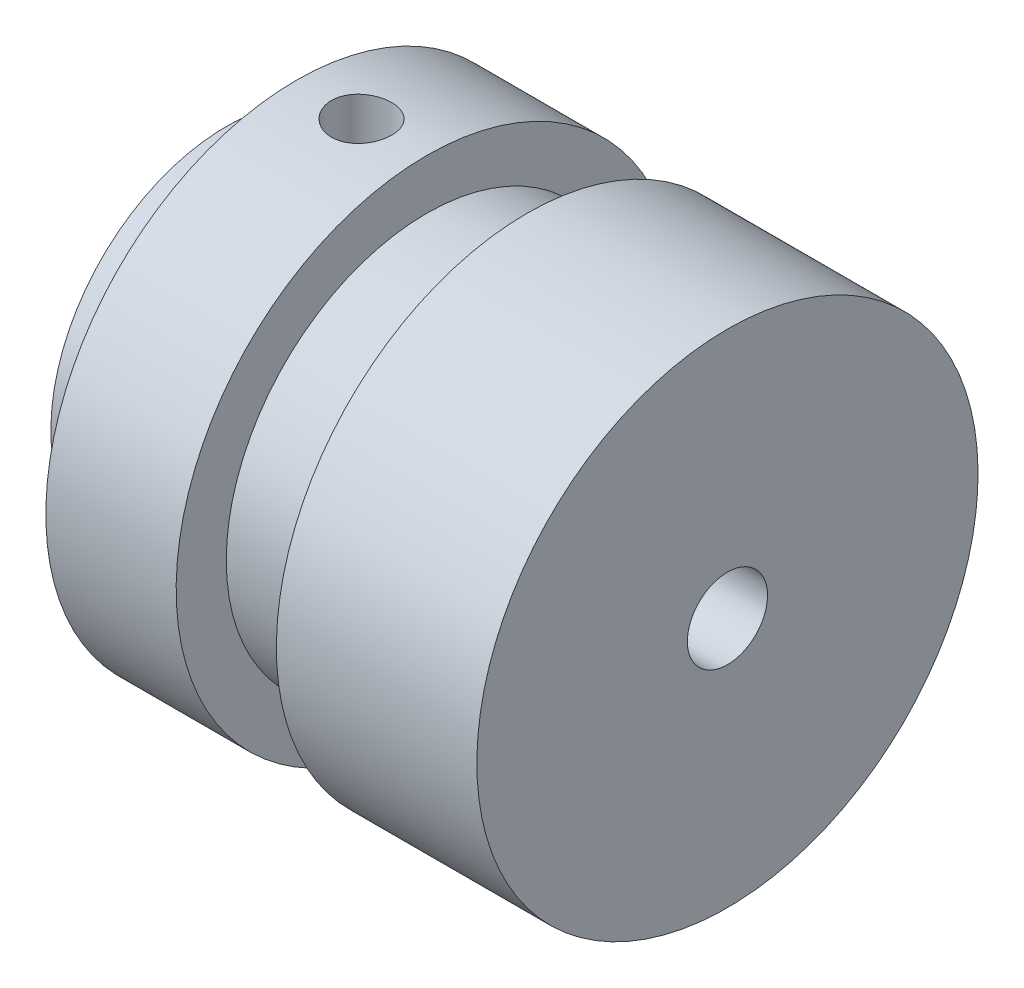
ISO-10303-21;
HEADER;
FILE_DESCRIPTION(('STEP AP214'),'2;1');
FILE_NAME('part.step','',(''),(''),'','','');
FILE_SCHEMA(('AUTOMOTIVE_DESIGN { 1 0 10303 214 1 1 1 1 }'));
ENDSEC;
DATA;
#1=APPLICATION_CONTEXT('core data for automotive mechanical design processes');
#2=APPLICATION_PROTOCOL_DEFINITION('international standard','automotive_design',2000,#1);
#3=PRODUCT_CONTEXT('',#1,'mechanical');
#4=PRODUCT('Part','Part','',(#3));
#5=PRODUCT_RELATED_PRODUCT_CATEGORY('part','',(#4));
#6=PRODUCT_DEFINITION_FORMATION('','',#4);
#7=PRODUCT_DEFINITION_CONTEXT('part definition',#1,'design');
#8=PRODUCT_DEFINITION('design','',#6,#7);
#9=PRODUCT_DEFINITION_SHAPE('','',#8);
#10=(LENGTH_UNIT() NAMED_UNIT(*) SI_UNIT(.MILLI.,.METRE.));
#11=(NAMED_UNIT(*) PLANE_ANGLE_UNIT() SI_UNIT($,.RADIAN.));
#12=(NAMED_UNIT(*) SI_UNIT($,.STERADIAN.) SOLID_ANGLE_UNIT());
#13=UNCERTAINTY_MEASURE_WITH_UNIT(LENGTH_MEASURE(1.E-05),#10,'distance_accuracy_value','');
#14=(GEOMETRIC_REPRESENTATION_CONTEXT(3) GLOBAL_UNCERTAINTY_ASSIGNED_CONTEXT((#13)) GLOBAL_UNIT_ASSIGNED_CONTEXT((#10,
#11,#12)) REPRESENTATION_CONTEXT('',''));
#15=CARTESIAN_POINT('',(0.,0.,0.));
#16=DIRECTION('',(0.,0.,1.));
#17=DIRECTION('',(1.,0.,0.));
#18=AXIS2_PLACEMENT_3D('',#15,#16,#17);
#19=CARTESIAN_POINT('',(-25.,0.,0.));
#20=DIRECTION('',(1.,0.,0.));
#21=DIRECTION('',(0.,-1.,0.));
#22=AXIS2_PLACEMENT_3D('',#19,#20,#21);
#23=PLANE('',#22);
#24=CARTESIAN_POINT('',(-25.,0.,0.));
#25=DIRECTION('',(1.,0.,0.));
#26=DIRECTION('',(0.,1.,0.));
#27=AXIS2_PLACEMENT_3D('',#24,#25,#26);
#28=CIRCLE('',#27,4.);
#29=CARTESIAN_POINT('',(-25.,4.,0.));
#30=VERTEX_POINT('',#29);
#31=EDGE_CURVE('E61',#30,#30,#28,.T.);
#32=ORIENTED_EDGE('',*,*,#31,.T.);
#33=EDGE_LOOP('',(#32));
#34=FACE_BOUND('',#33,.T.);
#35=CARTESIAN_POINT('',(-25.,0.,0.));
#36=DIRECTION('',(-1.,0.,0.));
#37=DIRECTION('',(0.,-1.,0.));
#38=AXIS2_PLACEMENT_3D('',#35,#36,#37);
#39=CIRCLE('',#38,17.5);
#40=CARTESIAN_POINT('',(-25.,-17.5,0.));
#41=VERTEX_POINT('',#40);
#42=EDGE_CURVE('E71',#41,#41,#39,.T.);
#43=ORIENTED_EDGE('',*,*,#42,.T.);
#44=EDGE_LOOP('',(#43));
#45=FACE_BOUND('',#44,.T.);
#46=ADVANCED_FACE('F33',(#34,#45),#23,.F.);
#47=CARTESIAN_POINT('',(-25.,0.,0.));
#48=DIRECTION('',(-1.,0.,0.));
#49=DIRECTION('',(0.,1.,0.));
#50=AXIS2_PLACEMENT_3D('',#47,#48,#49);
#51=CYLINDRICAL_SURFACE('',#50,25.);
#52=CARTESIAN_POINT('',(-8.5,25.,0.));
#53=CARTESIAN_POINT('',(-8.50000716394143,24.9999977357459,0.1678640471077));
#54=CARTESIAN_POINT('',(-8.51413665869268,24.9982914200408,0.335834317331192));
#55=CARTESIAN_POINT('',(-8.57028106415538,24.991648705422,0.66710457130825));
#56=CARTESIAN_POINT('',(-8.61232544125059,24.9867088933728,0.830399429590069));
#57=CARTESIAN_POINT('',(-8.72304627652601,24.9741559265426,1.14747479534053));
#58=CARTESIAN_POINT('',(-8.79170520682418,24.9665445315309,1.30126148759225));
#59=CARTESIAN_POINT('',(-8.9536687350833,24.9494959264345,1.595099157832));
#60=CARTESIAN_POINT('',(-9.04696895975331,24.9400590404141,1.73515256713516));
#61=CARTESIAN_POINT('',(-9.25607486197524,24.920360105442,1.99829131534451));
#62=CARTESIAN_POINT('',(-9.37198084011192,24.9100945030904,2.1212966913072));
#63=CARTESIAN_POINT('',(-9.6227929648879,24.8899239397152,2.34615931038342));
#64=CARTESIAN_POINT('',(-9.75770005901865,24.8800189967068,2.44801549826474));
#65=CARTESIAN_POINT('',(-10.0432008252984,24.8616560370405,2.62798342873896));
#66=CARTESIAN_POINT('',(-10.1938417245801,24.8532025903971,2.7060207567257));
#67=CARTESIAN_POINT('',(-10.5062087021087,24.8387461344686,2.8356605730156));
#68=CARTESIAN_POINT('',(-10.6679343919693,24.8327430393798,2.88726398696776));
#69=CARTESIAN_POINT('',(-10.9970528593114,24.8239006073737,2.962329300454));
#70=CARTESIAN_POINT('',(-11.1644145284277,24.8210461452543,2.98592577987646));
#71=CARTESIAN_POINT('',(-11.5007449363642,24.8187777690611,3.0047237521967));
#72=CARTESIAN_POINT('',(-11.669713615217,24.8193637271033,2.99992630052848));
#73=CARTESIAN_POINT('',(-12.0035259647843,24.8238961466306,2.96218316078668));
#74=CARTESIAN_POINT('',(-12.1683866386802,24.8278249434675,2.92938543222303));
#75=CARTESIAN_POINT('',(-12.4902470278214,24.8385728087608,2.83680346170067));
#76=CARTESIAN_POINT('',(-12.647246595179,24.8453919315688,2.77701871225814));
#77=CARTESIAN_POINT('',(-12.9493894682391,24.8611722079476,2.63199980699862));
#78=CARTESIAN_POINT('',(-13.0945014783536,24.8701387862198,2.54670106203925));
#79=CARTESIAN_POINT('',(-13.3684072109158,24.8891993987901,2.35312173169469));
#80=CARTESIAN_POINT('',(-13.4972002449026,24.8992934806213,2.24484017723157));
#81=CARTESIAN_POINT('',(-13.7356710843644,24.9195503308637,2.0075475556218));
#82=CARTESIAN_POINT('',(-13.8452219698571,24.929713127424,1.87840890051216));
#83=CARTESIAN_POINT('',(-14.0411115210003,24.9489020798549,1.60350795893872));
#84=CARTESIAN_POINT('',(-14.1274501400191,24.9579282334421,1.45774563908005));
#85=CARTESIAN_POINT('',(-14.2744632856397,24.9738318861702,1.15363930826285));
#86=CARTESIAN_POINT('',(-14.3351301933304,24.9807087472809,0.995291578715592));
#87=CARTESIAN_POINT('',(-14.4289787378509,24.991533065309,0.67055602227344));
#88=CARTESIAN_POINT('',(-14.4621615600045,24.9954806485584,0.504168542441624));
#89=CARTESIAN_POINT('',(-14.4999362554977,24.9999852500304,0.169174396374218));
#90=CARTESIAN_POINT('',(-14.5047030324007,25.0005630093753,0.00058772043205261));
#91=CARTESIAN_POINT('',(-14.4859714221317,24.9983187823231,-0.334982068243259));
#92=CARTESIAN_POINT('',(-14.4624735887046,24.9954968625308,-0.501965212327328));
#93=CARTESIAN_POINT('',(-14.3880250359969,24.9867833380686,-0.829074263928356));
#94=CARTESIAN_POINT('',(-14.3371573869499,24.9809010237909,-0.989219346369035));
#95=CARTESIAN_POINT('',(-14.2094992966464,24.9667255501792,-1.29870539768646));
#96=CARTESIAN_POINT('',(-14.1327080385099,24.9584323148759,-1.44804602592347));
#97=CARTESIAN_POINT('',(-13.9549570840976,24.9403085158695,-1.73246717766504));
#98=CARTESIAN_POINT('',(-13.8538838621892,24.9304708084643,-1.86747628962751));
#99=CARTESIAN_POINT('',(-13.6305991535918,24.9103817919419,-2.11867625152203));
#100=CARTESIAN_POINT('',(-13.5083868958521,24.9001304677484,-2.23486641472949));
#101=CARTESIAN_POINT('',(-13.2455243845723,24.8803059484942,-2.44574795226154));
#102=CARTESIAN_POINT('',(-13.1047809846562,24.8707365831307,-2.54032363231939));
#103=CARTESIAN_POINT('',(-12.8093049749244,24.8534214993383,-2.70449314429332));
#104=CARTESIAN_POINT('',(-12.6545726268818,24.8456757467943,-2.77408744356074));
#105=CARTESIAN_POINT('',(-12.3358893911053,24.8329105734502,-2.88612996668159));
#106=CARTESIAN_POINT('',(-12.1719619881406,24.8278845275633,-2.92864420159346));
#107=CARTESIAN_POINT('',(-11.8392310305149,24.8211085274587,-2.98553272163517));
#108=CARTESIAN_POINT('',(-11.6704276838427,24.8193584337106,-2.99990820526081));
#109=CARTESIAN_POINT('',(-11.3338872703628,24.819336326607,-3.00009033817931));
#110=CARTESIAN_POINT('',(-11.1661502742287,24.8210421863943,-2.98607873671351));
#111=CARTESIAN_POINT('',(-10.8354332136058,24.8276922947425,-2.93026848672089));
#112=CARTESIAN_POINT('',(-10.6724531508244,24.8326365444656,-2.88846982822067));
#113=CARTESIAN_POINT('',(-10.3558954611113,24.8451996524586,-2.77832739820545));
#114=CARTESIAN_POINT('',(-10.2023150065045,24.8528177016812,-2.70999165570539));
#115=CARTESIAN_POINT('',(-9.9087722529299,24.8698714539139,-2.5487328262801));
#116=CARTESIAN_POINT('',(-9.7688100715407,24.8793071726153,-2.45580952709445));
#117=CARTESIAN_POINT('',(-9.50554705989116,24.8990055122588,-2.24733689647205));
#118=CARTESIAN_POINT('',(-9.38235389673372,24.9092728581347,-2.1316520393015));
#119=CARTESIAN_POINT('',(-9.157057520434,24.9294354968169,-1.88122093334448));
#120=CARTESIAN_POINT('',(-9.05495930237081,24.939330701051,-1.74647018263601));
#121=CARTESIAN_POINT('',(-8.87444942200114,24.9576721709324,-1.46119322465137));
#122=CARTESIAN_POINT('',(-8.79612227427771,24.966113221621,-1.31061323462418));
#123=CARTESIAN_POINT('',(-8.66597623555743,24.9805418519727,-0.998422751685315));
#124=CARTESIAN_POINT('',(-8.61412830381961,24.9865321180615,-0.836824564362147));
#125=CARTESIAN_POINT('',(-8.55093657966188,24.9939268325999,-0.561977101236698));
#126=CARTESIAN_POINT('',(-8.53186251611362,24.996193279433,-0.450466569753488));
#127=CARTESIAN_POINT('',(-8.50639185650904,24.9992306204204,-0.225986735693695));
#128=CARTESIAN_POINT('',(-8.49999517674955,25.0000015244492,-0.113017442753626));
#129=CARTESIAN_POINT('',(-8.5,25.,0.));
#130=B_SPLINE_CURVE_WITH_KNOTS('',3,(#52,#53,#54,#55,#56,#57,#58,#59,#60,#61,#62,#63,#64,#65,
#66,#67,#68,#69,#70,#71,#72,#73,#74,#75,#76,#77,#78,#79,#80,#81,#82,#83,#84,#85,#86,#87,#88,#89,
#90,#91,#92,#93,#94,#95,#96,#97,#98,#99,#100,#101,#102,#103,#104,#105,#106,#107,#108,#109,#110,
#111,#112,#113,#114,#115,#116,#117,#118,#119,#120,#121,#122,#123,#124,#125,#126,#127,#128,#129),
.UNSPECIFIED.,.T.,.F.,(4,2,2,2,2,2,2,2,2,2,2,2,2,2,2,2,2,2,2,2,2,2,2,2,2,2,2,2,2,2,2,2,2,2,2,2,
2,2,4),(0.,0.50317935095616,1.00689069408623,1.5102708637556,2.01356175441693,2.51913872195878,
3.02474090904883,3.53190689496398,4.03905511999114,4.54375638343279,5.0484388866848,
5.55047092912253,6.05251241253396,6.55583573710536,7.05918028869262,7.56572944640317,
8.07227962172601,8.57898002694279,9.08565857822619,9.58921522624226,10.0927620090108,
10.5947890255775,11.0968318630167,11.6012692178556,12.1057249760357,12.6128207581672,
13.119907053063,13.6257524826489,14.1315763666154,14.6341719319229,15.1367676776234,
15.6392114771388,16.1416596143122,16.6471952402032,17.1528504352009,17.6602829023946,
18.1671576479275,18.5059342945627,18.8447087043981),.UNSPECIFIED.);
#131=CARTESIAN_POINT('',(-8.5,25.,0.));
#132=VERTEX_POINT('',#131);
#133=EDGE_CURVE('E74',#132,#132,#130,.T.);
#134=ORIENTED_EDGE('',*,*,#133,.T.);
#135=EDGE_LOOP('',(#134));
#136=FACE_BOUND('',#135,.T.);
#137=CARTESIAN_POINT('',(-5.,0.,0.));
#138=DIRECTION('',(1.,0.,0.));
#139=DIRECTION('',(0.,1.,0.));
#140=AXIS2_PLACEMENT_3D('',#137,#138,#139);
#141=CIRCLE('',#140,25.);
#142=CARTESIAN_POINT('',(-5.,25.,0.));
#143=VERTEX_POINT('',#142);
#144=EDGE_CURVE('E64',#143,#143,#141,.T.);
#145=ORIENTED_EDGE('',*,*,#144,.F.);
#146=EDGE_LOOP('',(#145));
#147=FACE_BOUND('',#146,.T.);
#148=CARTESIAN_POINT('',(-18.,0.,0.));
#149=DIRECTION('',(-1.,0.,0.));
#150=DIRECTION('',(0.,-1.,0.));
#151=AXIS2_PLACEMENT_3D('',#148,#149,#150);
#152=CIRCLE('',#151,25.);
#153=CARTESIAN_POINT('',(-18.,-25.,0.));
#154=VERTEX_POINT('',#153);
#155=EDGE_CURVE('E67',#154,#154,#152,.T.);
#156=ORIENTED_EDGE('',*,*,#155,.F.);
#157=EDGE_LOOP('',(#156));
#158=FACE_BOUND('',#157,.T.);
#159=ADVANCED_FACE('F82',(#136,#147,#158),#51,.T.);
#160=CARTESIAN_POINT('',(5.,0.,0.));
#161=DIRECTION('',(-1.,0.,0.));
#162=DIRECTION('',(0.,-1.,0.));
#163=AXIS2_PLACEMENT_3D('',#160,#161,#162);
#164=PLANE('',#163);
#165=CARTESIAN_POINT('',(5.,0.,0.));
#166=DIRECTION('',(1.,0.,0.));
#167=DIRECTION('',(0.,1.,0.));
#168=AXIS2_PLACEMENT_3D('',#165,#166,#167);
#169=CIRCLE('',#168,20.);
#170=CARTESIAN_POINT('',(5.,20.,0.));
#171=VERTEX_POINT('',#170);
#172=EDGE_CURVE('E10',#171,#171,#169,.T.);
#173=ORIENTED_EDGE('',*,*,#172,.T.);
#174=EDGE_LOOP('',(#173));
#175=FACE_BOUND('',#174,.T.);
#176=CARTESIAN_POINT('',(5.,0.,0.));
#177=DIRECTION('',(1.,0.,0.));
#178=DIRECTION('',(0.,1.,0.));
#179=AXIS2_PLACEMENT_3D('',#176,#177,#178);
#180=CIRCLE('',#179,25.);
#181=CARTESIAN_POINT('',(5.,25.,0.));
#182=VERTEX_POINT('',#181);
#183=EDGE_CURVE('E55',#182,#182,#180,.T.);
#184=ORIENTED_EDGE('',*,*,#183,.F.);
#185=EDGE_LOOP('',(#184));
#186=FACE_BOUND('',#185,.T.);
#187=ADVANCED_FACE('F35',(#175,#186),#164,.T.);
#188=CARTESIAN_POINT('',(25.,0.,0.));
#189=DIRECTION('',(1.,0.,0.));
#190=DIRECTION('',(0.,1.,0.));
#191=AXIS2_PLACEMENT_3D('',#188,#189,#190);
#192=CYLINDRICAL_SURFACE('',#191,20.);
#193=ORIENTED_EDGE('',*,*,#172,.F.);
#194=EDGE_LOOP('',(#193));
#195=FACE_BOUND('',#194,.T.);
#196=CARTESIAN_POINT('',(-5.,0.,0.));
#197=DIRECTION('',(1.,0.,0.));
#198=DIRECTION('',(0.,1.,0.));
#199=AXIS2_PLACEMENT_3D('',#196,#197,#198);
#200=CIRCLE('',#199,20.);
#201=CARTESIAN_POINT('',(-5.,20.,0.));
#202=VERTEX_POINT('',#201);
#203=EDGE_CURVE('E58',#202,#202,#200,.T.);
#204=ORIENTED_EDGE('',*,*,#203,.T.);
#205=EDGE_LOOP('',(#204));
#206=FACE_BOUND('',#205,.T.);
#207=ADVANCED_FACE('F125',(#195,#206),#192,.T.);
#208=CARTESIAN_POINT('',(25.,0.,0.));
#209=DIRECTION('',(1.,0.,0.));
#210=DIRECTION('',(0.,1.,0.));
#211=AXIS2_PLACEMENT_3D('',#208,#209,#210);
#212=CYLINDRICAL_SURFACE('',#211,4.);
#213=CARTESIAN_POINT('',(-14.5,4.,0.));
#214=CARTESIAN_POINT('',(-14.499999257981,3.99999929901188,-0.0732613677680272));
#215=CARTESIAN_POINT('',(-14.4973094930131,3.99798060344642,-0.146542351053627));
#216=CARTESIAN_POINT('',(-14.486605139865,3.98996245699389,-0.292508538993504));
#217=CARTESIAN_POINT('',(-14.4785873654952,3.98396062416368,-0.365193360793216));
#218=CARTESIAN_POINT('',(-14.4466640939718,3.96012745087106,-0.581731406983921));
#219=CARTESIAN_POINT('',(-14.4148890420089,3.93646888013437,-0.723892660392384));
#220=CARTESIAN_POINT('',(-14.3325747924248,3.87591490407891,-0.998506639011301));
#221=CARTESIAN_POINT('',(-14.2821496516171,3.8391000031407,-1.13101263465653));
#222=CARTESIAN_POINT('',(-14.1649146330685,3.75501017021524,-1.38483526994092));
#223=CARTESIAN_POINT('',(-14.0981095484165,3.70773829853535,-1.50615516858413));
#224=CARTESIAN_POINT('',(-13.9434762747794,3.60099357013528,-1.74693213195157));
#225=CARTESIAN_POINT('',(-13.8542741487267,3.54079623314279,-1.86517631030519));
#226=CARTESIAN_POINT('',(-13.660999504157,3.41533027981217,-2.08606449940779));
#227=CARTESIAN_POINT('',(-13.5569040275522,3.35005390635212,-2.18868391091458));
#228=CARTESIAN_POINT('',(-13.3794646558954,3.24492237261661,-2.33993228026195));
#229=CARTESIAN_POINT('',(-13.3103698875906,3.2052891581058,-2.39379458304144));
#230=CARTESIAN_POINT('',(-13.1674108691757,3.12676887933752,-2.49548358548255));
#231=CARTESIAN_POINT('',(-13.093545190949,3.0878820430606,-2.54330846513547));
#232=CARTESIAN_POINT('',(-12.9412282051198,3.01210562553027,-2.63261178619331));
#233=CARTESIAN_POINT('',(-12.8627825620375,2.9752136814322,-2.67409784691839));
#234=CARTESIAN_POINT('',(-12.7012929524511,2.90479339731391,-2.75043132677141));
#235=CARTESIAN_POINT('',(-12.6182497332861,2.87126451310281,-2.78527982077503));
#236=CARTESIAN_POINT('',(-12.4210377245763,2.7995453278082,-2.85760090658949));
#237=CARTESIAN_POINT('',(-12.3052302260654,2.76315561923756,-2.89251037008408));
#238=CARTESIAN_POINT('',(-12.0672029368659,2.70343128888205,-2.94841656316143));
#239=CARTESIAN_POINT('',(-11.9449985256633,2.6800667983994,-2.96944514417499));
#240=CARTESIAN_POINT('',(-11.6956379755282,2.65007535494332,-2.99625559824299));
#241=CARTESIAN_POINT('',(-11.5684472267166,2.64360057658759,-3.00189887157292));
#242=CARTESIAN_POINT('',(-11.3147693377709,2.64919059245027,-2.99696449042943));
#243=CARTESIAN_POINT('',(-11.188282466205,2.66126203341492,-2.98638102048541));
#244=CARTESIAN_POINT('',(-10.9536174959404,2.69935247502784,-2.95195473462658));
#245=CARTESIAN_POINT('',(-10.8449273098642,2.72374314386008,-2.92964971367058));
#246=CARTESIAN_POINT('',(-10.6331221905517,2.78228385423355,-2.87411343637384));
#247=CARTESIAN_POINT('',(-10.530012727386,2.81644327194564,-2.84087167817736));
#248=CARTESIAN_POINT('',(-10.2674872543126,2.91483538729993,-2.74066127604793));
#249=CARTESIAN_POINT('',(-10.1131991741164,2.98451298316589,-2.6656029678939));
#250=CARTESIAN_POINT('',(-9.82160694484032,3.13066596252173,-2.49236046828095));
#251=CARTESIAN_POINT('',(-9.68434531948443,3.20715757761232,-2.39412008565051));
#252=CARTESIAN_POINT('',(-9.42449322124942,3.36103344637552,-2.17303208149636));
#253=CARTESIAN_POINT('',(-9.30235878676777,3.43839173465928,-2.04962751039983));
#254=CARTESIAN_POINT('',(-9.07947270590797,3.58496075956505,-1.78084504353984));
#255=CARTESIAN_POINT('',(-8.97868015947125,3.65418696517002,-1.63551010852546));
#256=CARTESIAN_POINT('',(-8.82003840157369,3.76559452155695,-1.3558041609579));
#257=CARTESIAN_POINT('',(-8.75763081142553,3.81041541916802,-1.2250797406269));
#258=CARTESIAN_POINT('',(-8.65155023921509,3.88745808807125,-0.952704346148673));
#259=CARTESIAN_POINT('',(-8.60786552362683,3.91968774910057,-0.811060281155401));
#260=CARTESIAN_POINT('',(-8.5414932735979,3.96891177371226,-0.519352465945108));
#261=CARTESIAN_POINT('',(-8.51893563974277,3.98581186314606,-0.369242566477488));
#262=CARTESIAN_POINT('',(-8.49690080763555,4.00231766947938,-0.0664024759297814));
#263=CARTESIAN_POINT('',(-8.49741387149444,4.0019306830649,0.0863265824213237));
#264=CARTESIAN_POINT('',(-8.52022173055466,3.98485095596869,0.37360842235857));
#265=CARTESIAN_POINT('',(-8.54032104534229,3.96980177630783,0.508444611327583));
#266=CARTESIAN_POINT('',(-8.59794758845683,3.92702635972251,0.772221384992233));
#267=CARTESIAN_POINT('',(-8.6354785251602,3.89929742534594,0.901160708783227));
#268=CARTESIAN_POINT('',(-8.72777495167151,3.83199678428177,1.15483339082487));
#269=CARTESIAN_POINT('',(-8.78310194754994,3.79204165281683,1.27925770587446));
#270=CARTESIAN_POINT('',(-8.90834532621351,3.70333906113672,1.51703769337244));
#271=CARTESIAN_POINT('',(-8.97826372729878,3.65459038471485,1.63039183139361));
#272=CARTESIAN_POINT('',(-9.14356468161399,3.54238575945113,1.86302046499997));
#273=CARTESIAN_POINT('',(-9.24124979477955,3.47783324855999,1.98012231440924));
#274=CARTESIAN_POINT('',(-9.45202480563463,3.34476768394493,2.19745073328884));
#275=CARTESIAN_POINT('',(-9.5651488146632,3.27624605925973,2.29763880438282));
#276=CARTESIAN_POINT('',(-9.75682983034246,3.16783641864784,2.44323760962616));
#277=CARTESIAN_POINT('',(-9.83085785820569,3.12757855224153,2.49441207840987));
#278=CARTESIAN_POINT('',(-9.98382672212754,3.04868523124073,2.59024776181558));
#279=CARTESIAN_POINT('',(-10.0627693480854,3.01005037642924,2.63490658340165));
#280=CARTESIAN_POINT('',(-10.3065828681879,2.89884735629486,2.75840992843588));
#281=CARTESIAN_POINT('',(-10.4790218761599,2.83062934493711,2.8272286655462));
#282=CARTESIAN_POINT('',(-10.7708462342454,2.74237306217227,2.91232161832907));
#283=CARTESIAN_POINT('',(-10.8847868404913,2.71391502535151,2.93862206696069));
#284=CARTESIAN_POINT('',(-11.1174095165656,2.67084233048458,2.97782857114492));
#285=CARTESIAN_POINT('',(-11.2360803833731,2.65619677881271,2.99076452454843));
#286=CARTESIAN_POINT('',(-11.4756591950609,2.64315167964507,3.00230698654587));
#287=CARTESIAN_POINT('',(-11.5965754144545,2.64483460597191,3.00084075038308));
#288=CARTESIAN_POINT('',(-11.8361141496783,2.66432917886907,2.98353723231362));
#289=CARTESIAN_POINT('',(-11.9547335038205,2.6821616385503,2.96768140541027));
#290=CARTESIAN_POINT('',(-12.2118255755851,2.73634639677126,2.91787829237152));
#291=CARTESIAN_POINT('',(-12.3489792346406,2.77589185811732,2.88073715900692));
#292=CARTESIAN_POINT('',(-12.613084861707,2.8676615343469,2.78938673066517));
#293=CARTESIAN_POINT('',(-12.740010031912,2.91991769887725,2.73513432117033));
#294=CARTESIAN_POINT('',(-12.9432724798348,3.01293440174582,2.63161322454641));
#295=CARTESIAN_POINT('',(-13.0226148562953,3.05189072454864,2.58648316812388));
#296=CARTESIAN_POINT('',(-13.1763147235327,3.13140535919093,2.48962257782423));
#297=CARTESIAN_POINT('',(-13.2506724800335,3.17196358545146,2.43789239621906));
#298=CARTESIAN_POINT('',(-13.3943554607104,3.25347248479454,2.32800429973169));
#299=CARTESIAN_POINT('',(-13.4636763487608,3.29442346245137,2.26984095281447));
#300=CARTESIAN_POINT('',(-13.5970201748663,3.37560324351169,2.14725580217517));
#301=CARTESIAN_POINT('',(-13.6610428515573,3.41583201121154,2.08283369004462));
#302=CARTESIAN_POINT('',(-13.7839733330772,3.49489651383712,1.94728190281497));
#303=CARTESIAN_POINT('',(-13.8428330813605,3.53371751668994,1.87609990910415));
#304=CARTESIAN_POINT('',(-13.9543297570627,3.60860502556332,1.72767987087953));
#305=CARTESIAN_POINT('',(-14.0069679917947,3.64467210969302,1.65044310433565));
#306=CARTESIAN_POINT('',(-14.1053419420548,3.71302541445824,1.49030317410492));
#307=CARTESIAN_POINT('',(-14.151089596432,3.74531815238001,1.40741018139534));
#308=CARTESIAN_POINT('',(-14.2350567160433,3.80521640467829,1.23634243548294));
#309=CARTESIAN_POINT('',(-14.2732800665065,3.8328243370667,1.14817043896907));
#310=CARTESIAN_POINT('',(-14.355562698967,3.89270294176923,0.92973914025755));
#311=CARTESIAN_POINT('',(-14.3955243628176,3.92219862865416,0.797123031202018));
#312=CARTESIAN_POINT('',(-14.4568448795893,3.96768259876897,0.525667463530598));
#313=CARTESIAN_POINT('',(-14.4782556867884,3.9837086019408,0.386846538130223));
#314=CARTESIAN_POINT('',(-14.4932092986235,3.99490938201699,0.205928000583102));
#315=CARTESIAN_POINT('',(-14.495753102821,3.99681576437034,0.164816108820163));
#316=CARTESIAN_POINT('',(-14.4991487985317,3.99936137264782,0.0824715620593061));
#317=CARTESIAN_POINT('',(-14.5000004176831,4.00000039458683,0.0412388886906547));
#318=CARTESIAN_POINT('',(-14.5,4.,0.));
#319=B_SPLINE_CURVE_WITH_KNOTS('',3,(#213,#214,#215,#216,#217,#218,#219,#220,#221,#222,#223,
#224,#225,#226,#227,#228,#229,#230,#231,#232,#233,#234,#235,#236,#237,#238,#239,#240,#241,#242,
#243,#244,#245,#246,#247,#248,#249,#250,#251,#252,#253,#254,#255,#256,#257,#258,#259,#260,#261,
#262,#263,#264,#265,#266,#267,#268,#269,#270,#271,#272,#273,#274,#275,#276,#277,#278,#279,#280,
#281,#282,#283,#284,#285,#286,#287,#288,#289,#290,#291,#292,#293,#294,#295,#296,#297,#298,#299,
#300,#301,#302,#303,#304,#305,#306,#307,#308,#309,#310,#311,#312,#313,#314,#315,#316,#317,#318),
.UNSPECIFIED.,.T.,.F.,(4,2,2,2,2,2,2,2,2,2,2,2,2,2,2,2,2,2,2,2,2,2,2,2,2,2,2,2,2,2,2,2,2,2,2,2,
2,2,2,2,2,2,2,2,2,2,2,2,2,2,2,2,4),(0.,0.219733524191398,0.43959856906899,0.879847634771395,
1.31744766307167,1.75491979362349,2.2329036222735,2.71163236402815,2.99983518527188,
3.28812468015057,3.57606487508902,3.86395840178997,4.24151729125786,4.61820678456564,
4.99827867308497,5.37848680666403,5.71806472391401,6.05796967267263,6.61051355677803,
7.16441076781762,7.73224459942165,8.29898017053365,8.75205702078762,9.20484951352218,
9.66040808399781,10.1157743699921,10.5253506608997,10.9350141243761,11.3591357103334,
11.7833160002107,12.2783345622972,12.7744651003689,13.0698938265096,13.3654307846348,
13.9540907813181,14.3138420927746,14.6727868466003,15.033545541411,15.3947698355934,
15.8348522835191,16.276052567115,16.5734564783343,16.8708445226935,17.1684856206864,
17.4661413927621,17.7663250552984,18.0664455283282,18.3660398682404,18.6654791022959,
19.0884486476652,19.5102297424977,19.6338980344064,19.7575862294511),.UNSPECIFIED.);
#320=CARTESIAN_POINT('',(-14.5,4.,0.));
#321=VERTEX_POINT('',#320);
#322=EDGE_CURVE('E37',#321,#321,#319,.T.);
#323=ORIENTED_EDGE('',*,*,#322,.F.);
#324=EDGE_LOOP('',(#323));
#325=FACE_BOUND('',#324,.T.);
#326=CARTESIAN_POINT('',(25.,0.,0.));
#327=DIRECTION('',(1.,0.,0.));
#328=DIRECTION('',(0.,1.,0.));
#329=AXIS2_PLACEMENT_3D('',#326,#327,#328);
#330=CIRCLE('',#329,4.);
#331=CARTESIAN_POINT('',(25.,4.,0.));
#332=VERTEX_POINT('',#331);
#333=EDGE_CURVE('E46',#332,#332,#330,.T.);
#334=ORIENTED_EDGE('',*,*,#333,.T.);
#335=EDGE_LOOP('',(#334));
#336=FACE_BOUND('',#335,.T.);
#337=ORIENTED_EDGE('',*,*,#31,.F.);
#338=EDGE_LOOP('',(#337));
#339=FACE_BOUND('',#338,.T.);
#340=ADVANCED_FACE('F121',(#325,#336,#339),#212,.F.);
#341=CARTESIAN_POINT('',(25.,0.,0.));
#342=DIRECTION('',(-1.,0.,0.));
#343=DIRECTION('',(0.,-1.,0.));
#344=AXIS2_PLACEMENT_3D('',#341,#342,#343);
#345=PLANE('',#344);
#346=ORIENTED_EDGE('',*,*,#333,.F.);
#347=EDGE_LOOP('',(#346));
#348=FACE_BOUND('',#347,.T.);
#349=CARTESIAN_POINT('',(25.,0.,0.));
#350=DIRECTION('',(1.,0.,0.));
#351=DIRECTION('',(0.,1.,0.));
#352=AXIS2_PLACEMENT_3D('',#349,#350,#351);
#353=CIRCLE('',#352,25.);
#354=CARTESIAN_POINT('',(25.,25.,0.));
#355=VERTEX_POINT('',#354);
#356=EDGE_CURVE('E50',#355,#355,#353,.T.);
#357=ORIENTED_EDGE('',*,*,#356,.T.);
#358=EDGE_LOOP('',(#357));
#359=FACE_BOUND('',#358,.T.);
#360=ADVANCED_FACE('F118',(#348,#359),#345,.F.);
#361=CARTESIAN_POINT('',(25.,0.,0.));
#362=DIRECTION('',(1.,0.,0.));
#363=DIRECTION('',(0.,1.,0.));
#364=AXIS2_PLACEMENT_3D('',#361,#362,#363);
#365=CYLINDRICAL_SURFACE('',#364,25.);
#366=ORIENTED_EDGE('',*,*,#356,.F.);
#367=EDGE_LOOP('',(#366));
#368=FACE_BOUND('',#367,.T.);
#369=ORIENTED_EDGE('',*,*,#183,.T.);
#370=EDGE_LOOP('',(#369));
#371=FACE_BOUND('',#370,.T.);
#372=ADVANCED_FACE('F102',(#368,#371),#365,.T.);
#373=CARTESIAN_POINT('',(-5.,0.,0.));
#374=DIRECTION('',(1.,0.,0.));
#375=DIRECTION('',(0.,-1.,0.));
#376=AXIS2_PLACEMENT_3D('',#373,#374,#375);
#377=PLANE('',#376);
#378=ORIENTED_EDGE('',*,*,#203,.F.);
#379=EDGE_LOOP('',(#378));
#380=FACE_BOUND('',#379,.T.);
#381=ORIENTED_EDGE('',*,*,#144,.T.);
#382=EDGE_LOOP('',(#381));
#383=FACE_BOUND('',#382,.T.);
#384=ADVANCED_FACE('F97',(#380,#383),#377,.T.);
#385=CARTESIAN_POINT('',(-18.,0.,0.));
#386=DIRECTION('',(-1.,0.,0.));
#387=DIRECTION('',(0.,-1.,0.));
#388=AXIS2_PLACEMENT_3D('',#385,#386,#387);
#389=PLANE('',#388);
#390=CARTESIAN_POINT('',(-18.,0.,0.));
#391=DIRECTION('',(-1.,0.,0.));
#392=DIRECTION('',(0.,-1.,0.));
#393=AXIS2_PLACEMENT_3D('',#390,#391,#392);
#394=CIRCLE('',#393,17.5);
#395=CARTESIAN_POINT('',(-18.,-17.5,0.));
#396=VERTEX_POINT('',#395);
#397=EDGE_CURVE('E70',#396,#396,#394,.T.);
#398=ORIENTED_EDGE('',*,*,#397,.F.);
#399=EDGE_LOOP('',(#398));
#400=FACE_BOUND('',#399,.T.);
#401=ORIENTED_EDGE('',*,*,#155,.T.);
#402=EDGE_LOOP('',(#401));
#403=FACE_BOUND('',#402,.T.);
#404=ADVANCED_FACE('F94',(#400,#403),#389,.T.);
#405=CARTESIAN_POINT('',(-18.,0.,0.));
#406=DIRECTION('',(-1.,0.,0.));
#407=DIRECTION('',(0.,-1.,0.));
#408=AXIS2_PLACEMENT_3D('',#405,#406,#407);
#409=CYLINDRICAL_SURFACE('',#408,17.5);
#410=ORIENTED_EDGE('',*,*,#397,.T.);
#411=EDGE_LOOP('',(#410));
#412=FACE_BOUND('',#411,.T.);
#413=ORIENTED_EDGE('',*,*,#42,.F.);
#414=EDGE_LOOP('',(#413));
#415=FACE_BOUND('',#414,.T.);
#416=ADVANCED_FACE('F90',(#412,#415),#409,.T.);
#417=CARTESIAN_POINT('',(-11.5,0.,0.));
#418=DIRECTION('',(0.,1.,0.));
#419=DIRECTION('',(0.,0.,1.));
#420=AXIS2_PLACEMENT_3D('',#417,#418,#419);
#421=CYLINDRICAL_SURFACE('',#420,3.);
#422=ORIENTED_EDGE('',*,*,#322,.T.);
#423=EDGE_LOOP('',(#422));
#424=FACE_BOUND('',#423,.T.);
#425=ORIENTED_EDGE('',*,*,#133,.F.);
#426=EDGE_LOOP('',(#425));
#427=FACE_BOUND('',#426,.T.);
#428=ADVANCED_FACE('F86',(#424,#427),#421,.F.);
#429=CLOSED_SHELL('',(#46,#159,#187,#207,#340,#360,#372,#384,#404,#416,#428));
#430=MANIFOLD_SOLID_BREP('B2',#429);
#431=ADVANCED_BREP_SHAPE_REPRESENTATION('',(#18,#430),#14);
#432=SHAPE_DEFINITION_REPRESENTATION(#9,#431);
ENDSEC;
END-ISO-10303-21;
